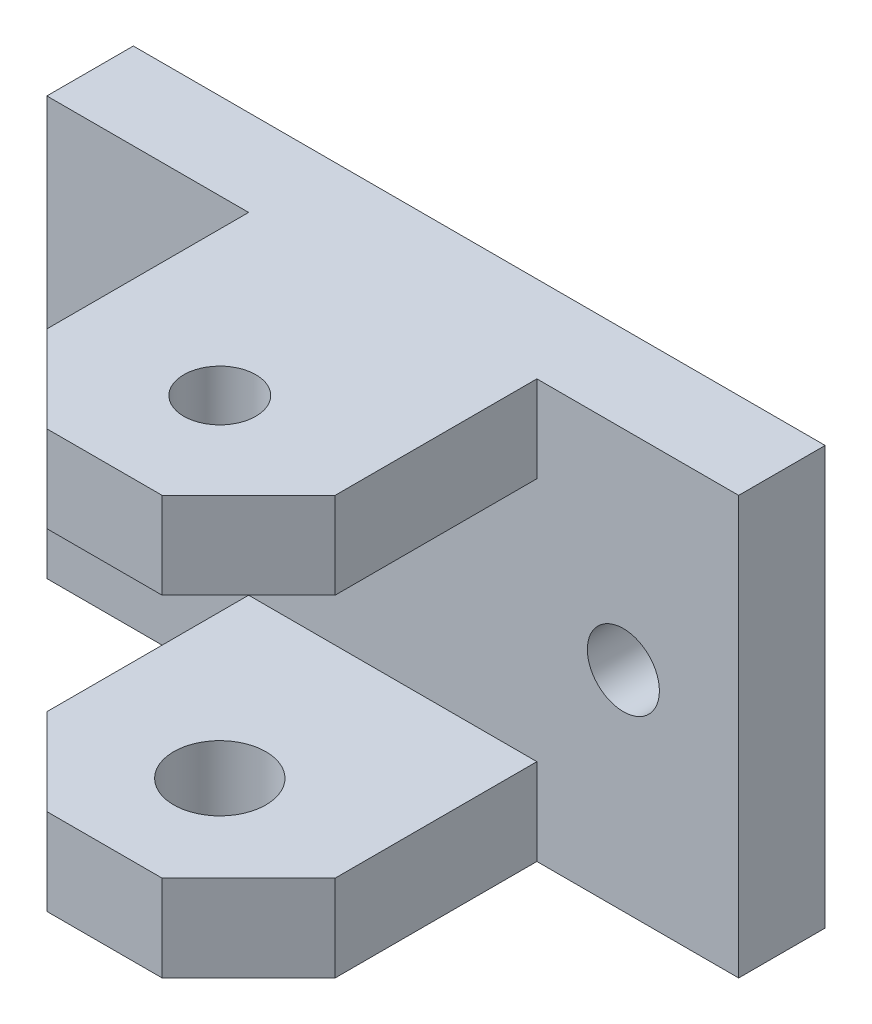
ISO-10303-21;
HEADER;
FILE_DESCRIPTION(('STEP AP214'),'2;1');
FILE_NAME('part.step','',(''),(''),'','','');
FILE_SCHEMA(('AUTOMOTIVE_DESIGN { 1 0 10303 214 1 1 1 1 }'));
ENDSEC;
DATA;
#1=APPLICATION_CONTEXT('core data for automotive mechanical design processes');
#2=APPLICATION_PROTOCOL_DEFINITION('international standard','automotive_design',2000,#1);
#3=PRODUCT_CONTEXT('',#1,'mechanical');
#4=PRODUCT('Part','Part','',(#3));
#5=PRODUCT_RELATED_PRODUCT_CATEGORY('part','',(#4));
#6=PRODUCT_DEFINITION_FORMATION('','',#4);
#7=PRODUCT_DEFINITION_CONTEXT('part definition',#1,'design');
#8=PRODUCT_DEFINITION('design','',#6,#7);
#9=PRODUCT_DEFINITION_SHAPE('','',#8);
#10=(LENGTH_UNIT() NAMED_UNIT(*) SI_UNIT(.MILLI.,.METRE.));
#11=(NAMED_UNIT(*) PLANE_ANGLE_UNIT() SI_UNIT($,.RADIAN.));
#12=(NAMED_UNIT(*) SI_UNIT($,.STERADIAN.) SOLID_ANGLE_UNIT());
#13=UNCERTAINTY_MEASURE_WITH_UNIT(LENGTH_MEASURE(1.E-05),#10,'distance_accuracy_value','');
#14=(GEOMETRIC_REPRESENTATION_CONTEXT(3) GLOBAL_UNCERTAINTY_ASSIGNED_CONTEXT((#13)) GLOBAL_UNIT_ASSIGNED_CONTEXT((#10,
#11,#12)) REPRESENTATION_CONTEXT('',''));
#15=CARTESIAN_POINT('',(0.,0.,0.));
#16=DIRECTION('',(0.,0.,1.));
#17=DIRECTION('',(1.,0.,0.));
#18=AXIS2_PLACEMENT_3D('',#15,#16,#17);
#19=CARTESIAN_POINT('',(0.,0.,3.));
#20=DIRECTION('',(0.,0.,-1.));
#21=DIRECTION('',(-1.,0.,0.));
#22=AXIS2_PLACEMENT_3D('',#19,#20,#21);
#23=PLANE('',#22);
#24=DIRECTION('',(-1.,0.,0.));
#25=VECTOR('',#24,1.);
#26=CARTESIAN_POINT('',(-12.,7.25,3.));
#27=LINE('',#26,#25);
#28=CARTESIAN_POINT('',(-5.,7.25,3.));
#29=VERTEX_POINT('',#28);
#30=CARTESIAN_POINT('',(-12.,7.25,3.));
#31=VERTEX_POINT('',#30);
#32=EDGE_CURVE('E264',#29,#31,#27,.T.);
#33=ORIENTED_EDGE('',*,*,#32,.T.);
#34=DIRECTION('',(0.,1.,0.));
#35=VECTOR('',#34,1.);
#36=CARTESIAN_POINT('',(-12.,7.25,3.));
#37=LINE('',#36,#35);
#38=CARTESIAN_POINT('',(-12.,-7.25,3.));
#39=VERTEX_POINT('',#38);
#40=EDGE_CURVE('E175',#39,#31,#37,.T.);
#41=ORIENTED_EDGE('',*,*,#40,.F.);
#42=DIRECTION('',(1.,0.,0.));
#43=VECTOR('',#42,1.);
#44=CARTESIAN_POINT('',(-12.,-7.25,3.));
#45=LINE('',#44,#43);
#46=CARTESIAN_POINT('',(-5.,-7.25,3.));
#47=VERTEX_POINT('',#46);
#48=EDGE_CURVE('E265',#39,#47,#45,.T.);
#49=ORIENTED_EDGE('',*,*,#48,.T.);
#50=DIRECTION('',(0.,-1.,0.));
#51=VECTOR('',#50,1.);
#52=CARTESIAN_POINT('',(-5.,0.,3.));
#53=LINE('',#52,#51);
#54=CARTESIAN_POINT('',(-5.,-4.25,3.));
#55=VERTEX_POINT('',#54);
#56=EDGE_CURVE('E256',#55,#47,#53,.T.);
#57=ORIENTED_EDGE('',*,*,#56,.F.);
#58=DIRECTION('',(1.,0.,0.));
#59=VECTOR('',#58,1.);
#60=CARTESIAN_POINT('',(0.,-4.25,3.));
#61=LINE('',#60,#59);
#62=CARTESIAN_POINT('',(5.,-4.25,3.));
#63=VERTEX_POINT('',#62);
#64=EDGE_CURVE('E251',#55,#63,#61,.T.);
#65=ORIENTED_EDGE('',*,*,#64,.T.);
#66=DIRECTION('',(0.,-1.,0.));
#67=VECTOR('',#66,1.);
#68=CARTESIAN_POINT('',(5.,0.,3.));
#69=LINE('',#68,#67);
#70=CARTESIAN_POINT('',(5.,-7.25,3.));
#71=VERTEX_POINT('',#70);
#72=EDGE_CURVE('E166',#63,#71,#69,.T.);
#73=ORIENTED_EDGE('',*,*,#72,.T.);
#74=CARTESIAN_POINT('',(12.,-7.25,3.));
#75=VERTEX_POINT('',#74);
#76=EDGE_CURVE('E263',#71,#75,#45,.T.);
#77=ORIENTED_EDGE('',*,*,#76,.T.);
#78=DIRECTION('',(0.,1.,0.));
#79=VECTOR('',#78,1.);
#80=CARTESIAN_POINT('',(12.,7.25,3.));
#81=LINE('',#80,#79);
#82=CARTESIAN_POINT('',(12.,7.25,3.));
#83=VERTEX_POINT('',#82);
#84=EDGE_CURVE('E179',#75,#83,#81,.T.);
#85=ORIENTED_EDGE('',*,*,#84,.T.);
#86=CARTESIAN_POINT('',(5.,7.25,3.));
#87=VERTEX_POINT('',#86);
#88=EDGE_CURVE('E261',#83,#87,#27,.T.);
#89=ORIENTED_EDGE('',*,*,#88,.T.);
#90=DIRECTION('',(0.,1.,0.));
#91=VECTOR('',#90,1.);
#92=CARTESIAN_POINT('',(5.,0.,3.));
#93=LINE('',#92,#91);
#94=CARTESIAN_POINT('',(5.,4.25,3.));
#95=VERTEX_POINT('',#94);
#96=EDGE_CURVE('E241',#95,#87,#93,.T.);
#97=ORIENTED_EDGE('',*,*,#96,.F.);
#98=DIRECTION('',(-1.,0.,0.));
#99=VECTOR('',#98,1.);
#100=CARTESIAN_POINT('',(0.,4.25,3.));
#101=LINE('',#100,#99);
#102=CARTESIAN_POINT('',(-5.,4.25,3.));
#103=VERTEX_POINT('',#102);
#104=EDGE_CURVE('E232',#95,#103,#101,.T.);
#105=ORIENTED_EDGE('',*,*,#104,.T.);
#106=DIRECTION('',(0.,1.,0.));
#107=VECTOR('',#106,1.);
#108=CARTESIAN_POINT('',(-5.,0.,3.));
#109=LINE('',#108,#107);
#110=EDGE_CURVE('E238',#103,#29,#109,.T.);
#111=ORIENTED_EDGE('',*,*,#110,.T.);
#112=EDGE_LOOP('',(#33,#41,#49,#57,#65,#73,#77,#85,#89,#97,#105,#111));
#113=FACE_BOUND('',#112,.T.);
#114=CARTESIAN_POINT('',(8.,0.,3.));
#115=DIRECTION('',(0.,0.,1.));
#116=DIRECTION('',(1.,0.,0.));
#117=AXIS2_PLACEMENT_3D('',#114,#115,#116);
#118=CIRCLE('',#117,1.24999999999999);
#119=CARTESIAN_POINT('',(9.24999999999999,0.,3.));
#120=VERTEX_POINT('',#119);
#121=EDGE_CURVE('E206',#120,#120,#118,.T.);
#122=ORIENTED_EDGE('',*,*,#121,.F.);
#123=EDGE_LOOP('',(#122));
#124=FACE_BOUND('',#123,.T.);
#125=CARTESIAN_POINT('',(-8.,0.,3.));
#126=DIRECTION('',(0.,0.,1.));
#127=DIRECTION('',(1.,0.,0.));
#128=AXIS2_PLACEMENT_3D('',#125,#126,#127);
#129=CIRCLE('',#128,1.24999999999999);
#130=CARTESIAN_POINT('',(-6.75000000000001,0.,3.));
#131=VERTEX_POINT('',#130);
#132=EDGE_CURVE('E200',#131,#131,#129,.T.);
#133=ORIENTED_EDGE('',*,*,#132,.F.);
#134=EDGE_LOOP('',(#133));
#135=FACE_BOUND('',#134,.T.);
#136=ADVANCED_FACE('F38',(#113,#124,#135),#23,.F.);
#137=CARTESIAN_POINT('',(-12.,7.25,3.));
#138=DIRECTION('',(0.,-1.,0.));
#139=DIRECTION('',(0.,0.,-1.));
#140=AXIS2_PLACEMENT_3D('',#137,#138,#139);
#141=PLANE('',#140);
#142=DIRECTION('',(1.,0.,0.));
#143=VECTOR('',#142,1.);
#144=CARTESIAN_POINT('',(-5.,7.25,13.));
#145=LINE('',#144,#143);
#146=CARTESIAN_POINT('',(-2.,7.25,13.));
#147=VERTEX_POINT('',#146);
#148=CARTESIAN_POINT('',(1.99999999999999,7.25,13.));
#149=VERTEX_POINT('',#148);
#150=EDGE_CURVE('E194',#147,#149,#145,.T.);
#151=ORIENTED_EDGE('',*,*,#150,.T.);
#152=DIRECTION('',(-0.707106781186549,0.,0.707106781186546));
#153=VECTOR('',#152,1.);
#154=CARTESIAN_POINT('',(5.,7.25,10.));
#155=LINE('',#154,#153);
#156=CARTESIAN_POINT('',(5.,7.25,10.));
#157=VERTEX_POINT('',#156);
#158=EDGE_CURVE('E285',#149,#157,#155,.F.);
#159=ORIENTED_EDGE('',*,*,#158,.T.);
#160=DIRECTION('',(0.,0.,1.));
#161=VECTOR('',#160,1.);
#162=CARTESIAN_POINT('',(5.,7.25,0.));
#163=LINE('',#162,#161);
#164=EDGE_CURVE('E224',#87,#157,#163,.T.);
#165=ORIENTED_EDGE('',*,*,#164,.F.);
#166=ORIENTED_EDGE('',*,*,#88,.F.);
#167=DIRECTION('',(0.,0.,1.));
#168=VECTOR('',#167,1.);
#169=CARTESIAN_POINT('',(12.,7.25,-14.5086181285469));
#170=LINE('',#169,#168);
#171=CARTESIAN_POINT('',(12.,7.25,0.));
#172=VERTEX_POINT('',#171);
#173=EDGE_CURVE('E160',#172,#83,#170,.T.);
#174=ORIENTED_EDGE('',*,*,#173,.F.);
#175=DIRECTION('',(-1.,0.,0.));
#176=VECTOR('',#175,1.);
#177=CARTESIAN_POINT('',(-12.,7.25,0.));
#178=LINE('',#177,#176);
#179=CARTESIAN_POINT('',(-12.,7.25,0.));
#180=VERTEX_POINT('',#179);
#181=EDGE_CURVE('E152',#172,#180,#178,.T.);
#182=ORIENTED_EDGE('',*,*,#181,.T.);
#183=DIRECTION('',(0.,0.,1.));
#184=VECTOR('',#183,1.);
#185=CARTESIAN_POINT('',(-12.,7.25,-14.5086181285469));
#186=LINE('',#185,#184);
#187=EDGE_CURVE('E157',#180,#31,#186,.T.);
#188=ORIENTED_EDGE('',*,*,#187,.T.);
#189=ORIENTED_EDGE('',*,*,#32,.F.);
#190=DIRECTION('',(0.,0.,1.));
#191=VECTOR('',#190,1.);
#192=CARTESIAN_POINT('',(-5.,7.25,0.));
#193=LINE('',#192,#191);
#194=CARTESIAN_POINT('',(-5.,7.25,9.99999999999999));
#195=VERTEX_POINT('',#194);
#196=EDGE_CURVE('E229',#29,#195,#193,.T.);
#197=ORIENTED_EDGE('',*,*,#196,.T.);
#198=DIRECTION('',(0.707106781186546,0.,0.707106781186549));
#199=VECTOR('',#198,1.);
#200=CARTESIAN_POINT('',(-2.,7.25,13.));
#201=LINE('',#200,#199);
#202=EDGE_CURVE('E283',#195,#147,#201,.T.);
#203=ORIENTED_EDGE('',*,*,#202,.T.);
#204=EDGE_LOOP('',(#151,#159,#165,#166,#174,#182,#188,#189,#197,#203));
#205=FACE_BOUND('',#204,.T.);
#206=CARTESIAN_POINT('',(0.,7.25,9.));
#207=DIRECTION('',(0.,1.,0.));
#208=DIRECTION('',(0.,0.,1.));
#209=AXIS2_PLACEMENT_3D('',#206,#207,#208);
#210=CIRCLE('',#209,1.24999999999999);
#211=CARTESIAN_POINT('',(0.,7.25,10.25));
#212=VERTEX_POINT('',#211);
#213=EDGE_CURVE('E212',#212,#212,#210,.T.);
#214=ORIENTED_EDGE('',*,*,#213,.F.);
#215=EDGE_LOOP('',(#214));
#216=FACE_BOUND('',#215,.T.);
#217=ADVANCED_FACE('F155',(#205,#216),#141,.F.);
#218=CARTESIAN_POINT('',(-12.,-7.25,3.));
#219=DIRECTION('',(0.,1.,0.));
#220=DIRECTION('',(0.,0.,1.));
#221=AXIS2_PLACEMENT_3D('',#218,#219,#220);
#222=PLANE('',#221);
#223=CARTESIAN_POINT('',(0.,-7.25,9.));
#224=DIRECTION('',(0.,-1.,0.));
#225=DIRECTION('',(0.,0.,-1.));
#226=AXIS2_PLACEMENT_3D('',#223,#224,#225);
#227=CIRCLE('',#226,1.6);
#228=CARTESIAN_POINT('',(0.,-7.25,7.4));
#229=VERTEX_POINT('',#228);
#230=EDGE_CURVE('E221',#229,#229,#227,.T.);
#231=ORIENTED_EDGE('',*,*,#230,.F.);
#232=EDGE_LOOP('',(#231));
#233=FACE_BOUND('',#232,.T.);
#234=DIRECTION('',(0.,0.,1.));
#235=VECTOR('',#234,1.);
#236=CARTESIAN_POINT('',(5.,-7.25,0.));
#237=LINE('',#236,#235);
#238=CARTESIAN_POINT('',(5.,-7.25,10.));
#239=VERTEX_POINT('',#238);
#240=EDGE_CURVE('E244',#71,#239,#237,.T.);
#241=ORIENTED_EDGE('',*,*,#240,.T.);
#242=DIRECTION('',(-0.707106781186549,0.,0.707106781186546));
#243=VECTOR('',#242,1.);
#244=CARTESIAN_POINT('',(5.,-7.25,10.));
#245=LINE('',#244,#243);
#246=CARTESIAN_POINT('',(1.99999999999999,-7.25,13.));
#247=VERTEX_POINT('',#246);
#248=EDGE_CURVE('E292',#239,#247,#245,.T.);
#249=ORIENTED_EDGE('',*,*,#248,.T.);
#250=DIRECTION('',(1.,0.,0.));
#251=VECTOR('',#250,1.);
#252=CARTESIAN_POINT('',(-5.,-7.25,13.));
#253=LINE('',#252,#251);
#254=CARTESIAN_POINT('',(-2.,-7.25,13.));
#255=VERTEX_POINT('',#254);
#256=EDGE_CURVE('E191',#255,#247,#253,.T.);
#257=ORIENTED_EDGE('',*,*,#256,.F.);
#258=DIRECTION('',(0.707106781186546,0.,0.707106781186549));
#259=VECTOR('',#258,1.);
#260=CARTESIAN_POINT('',(-2.,-7.25,13.));
#261=LINE('',#260,#259);
#262=CARTESIAN_POINT('',(-5.,-7.25,9.99999999999999));
#263=VERTEX_POINT('',#262);
#264=EDGE_CURVE('E290',#255,#263,#261,.F.);
#265=ORIENTED_EDGE('',*,*,#264,.T.);
#266=DIRECTION('',(0.,0.,1.));
#267=VECTOR('',#266,1.);
#268=CARTESIAN_POINT('',(-5.,-7.25,0.));
#269=LINE('',#268,#267);
#270=EDGE_CURVE('E249',#47,#263,#269,.T.);
#271=ORIENTED_EDGE('',*,*,#270,.F.);
#272=ORIENTED_EDGE('',*,*,#48,.F.);
#273=DIRECTION('',(0.,0.,1.));
#274=VECTOR('',#273,1.);
#275=CARTESIAN_POINT('',(-12.,-7.25,-14.5086181285469));
#276=LINE('',#275,#274);
#277=CARTESIAN_POINT('',(-12.,-7.25,0.));
#278=VERTEX_POINT('',#277);
#279=EDGE_CURVE('E186',#278,#39,#276,.T.);
#280=ORIENTED_EDGE('',*,*,#279,.F.);
#281=DIRECTION('',(1.,0.,0.));
#282=VECTOR('',#281,1.);
#283=CARTESIAN_POINT('',(-12.,-7.25,0.));
#284=LINE('',#283,#282);
#285=CARTESIAN_POINT('',(12.,-7.25,0.));
#286=VERTEX_POINT('',#285);
#287=EDGE_CURVE('E165',#278,#286,#284,.T.);
#288=ORIENTED_EDGE('',*,*,#287,.T.);
#289=DIRECTION('',(0.,0.,1.));
#290=VECTOR('',#289,1.);
#291=CARTESIAN_POINT('',(12.,-7.25,-14.5086181285469));
#292=LINE('',#291,#290);
#293=EDGE_CURVE('E182',#286,#75,#292,.T.);
#294=ORIENTED_EDGE('',*,*,#293,.T.);
#295=ORIENTED_EDGE('',*,*,#76,.F.);
#296=EDGE_LOOP('',(#241,#249,#257,#265,#271,#272,#280,#288,#294,#295));
#297=FACE_BOUND('',#296,.T.);
#298=ADVANCED_FACE('F316',(#233,#297),#222,.F.);
#299=CARTESIAN_POINT('',(0.,0.,0.));
#300=DIRECTION('',(0.,0.,-1.));
#301=DIRECTION('',(-1.,0.,0.));
#302=AXIS2_PLACEMENT_3D('',#299,#300,#301);
#303=PLANE('',#302);
#304=ORIENTED_EDGE('',*,*,#287,.F.);
#305=DIRECTION('',(0.,1.,0.));
#306=VECTOR('',#305,1.);
#307=CARTESIAN_POINT('',(-12.,7.25,0.));
#308=LINE('',#307,#306);
#309=EDGE_CURVE('E172',#278,#180,#308,.T.);
#310=ORIENTED_EDGE('',*,*,#309,.T.);
#311=ORIENTED_EDGE('',*,*,#181,.F.);
#312=DIRECTION('',(0.,1.,0.));
#313=VECTOR('',#312,1.);
#314=CARTESIAN_POINT('',(12.,7.25,0.));
#315=LINE('',#314,#313);
#316=EDGE_CURVE('E188',#286,#172,#315,.T.);
#317=ORIENTED_EDGE('',*,*,#316,.F.);
#318=EDGE_LOOP('',(#304,#310,#311,#317));
#319=FACE_BOUND('',#318,.T.);
#320=CARTESIAN_POINT('',(-8.,0.,0.));
#321=DIRECTION('',(0.,0.,-1.));
#322=DIRECTION('',(-1.,0.,0.));
#323=AXIS2_PLACEMENT_3D('',#320,#321,#322);
#324=CIRCLE('',#323,1.24999999999999);
#325=CARTESIAN_POINT('',(-9.24999999999999,0.,0.));
#326=VERTEX_POINT('',#325);
#327=EDGE_CURVE('E203',#326,#326,#324,.T.);
#328=ORIENTED_EDGE('',*,*,#327,.F.);
#329=EDGE_LOOP('',(#328));
#330=FACE_BOUND('',#329,.T.);
#331=CARTESIAN_POINT('',(8.,0.,0.));
#332=DIRECTION('',(0.,0.,-1.));
#333=DIRECTION('',(-1.,0.,0.));
#334=AXIS2_PLACEMENT_3D('',#331,#332,#333);
#335=CIRCLE('',#334,1.24999999999999);
#336=CARTESIAN_POINT('',(6.75000000000001,0.,0.));
#337=VERTEX_POINT('',#336);
#338=EDGE_CURVE('E209',#337,#337,#335,.T.);
#339=ORIENTED_EDGE('',*,*,#338,.F.);
#340=EDGE_LOOP('',(#339));
#341=FACE_BOUND('',#340,.T.);
#342=ADVANCED_FACE('F177',(#319,#330,#341),#303,.T.);
#343=CARTESIAN_POINT('',(5.,-4.25,0.));
#344=DIRECTION('',(1.,0.,0.));
#345=DIRECTION('',(0.,0.,-1.));
#346=AXIS2_PLACEMENT_3D('',#343,#344,#345);
#347=PLANE('',#346);
#348=DIRECTION('',(0.,0.,1.));
#349=VECTOR('',#348,1.);
#350=CARTESIAN_POINT('',(5.,-4.25,0.));
#351=LINE('',#350,#349);
#352=CARTESIAN_POINT('',(5.,-4.25,10.));
#353=VERTEX_POINT('',#352);
#354=EDGE_CURVE('E245',#63,#353,#351,.T.);
#355=ORIENTED_EDGE('',*,*,#354,.T.);
#356=DIRECTION('',(0.,-1.,0.));
#357=VECTOR('',#356,1.);
#358=CARTESIAN_POINT('',(5.,-7.25,10.));
#359=LINE('',#358,#357);
#360=EDGE_CURVE('E287',#353,#239,#359,.T.);
#361=ORIENTED_EDGE('',*,*,#360,.T.);
#362=ORIENTED_EDGE('',*,*,#240,.F.);
#363=ORIENTED_EDGE('',*,*,#72,.F.);
#364=EDGE_LOOP('',(#355,#361,#362,#363));
#365=FACE_BOUND('',#364,.T.);
#366=ADVANCED_FACE('F311',(#365),#347,.T.);
#367=CARTESIAN_POINT('',(-5.,-4.25,0.));
#368=DIRECTION('',(1.,0.,0.));
#369=DIRECTION('',(0.,0.,-1.));
#370=AXIS2_PLACEMENT_3D('',#367,#368,#369);
#371=PLANE('',#370);
#372=ORIENTED_EDGE('',*,*,#270,.T.);
#373=DIRECTION('',(0.,1.,0.));
#374=VECTOR('',#373,1.);
#375=CARTESIAN_POINT('',(-5.,-4.25,9.99999999999999));
#376=LINE('',#375,#374);
#377=CARTESIAN_POINT('',(-5.,-4.25,9.99999999999999));
#378=VERTEX_POINT('',#377);
#379=EDGE_CURVE('E46',#263,#378,#376,.T.);
#380=ORIENTED_EDGE('',*,*,#379,.T.);
#381=DIRECTION('',(0.,0.,1.));
#382=VECTOR('',#381,1.);
#383=CARTESIAN_POINT('',(-5.,-4.25,0.));
#384=LINE('',#383,#382);
#385=EDGE_CURVE('E248',#55,#378,#384,.T.);
#386=ORIENTED_EDGE('',*,*,#385,.F.);
#387=ORIENTED_EDGE('',*,*,#56,.T.);
#388=EDGE_LOOP('',(#372,#380,#386,#387));
#389=FACE_BOUND('',#388,.T.);
#390=ADVANCED_FACE('F323',(#389),#371,.F.);
#391=CARTESIAN_POINT('',(0.,-4.25,0.));
#392=DIRECTION('',(0.,1.,0.));
#393=DIRECTION('',(-1.,0.,0.));
#394=AXIS2_PLACEMENT_3D('',#391,#392,#393);
#395=PLANE('',#394);
#396=DIRECTION('',(-1.,0.,0.));
#397=VECTOR('',#396,1.);
#398=CARTESIAN_POINT('',(0.,-4.25,13.));
#399=LINE('',#398,#397);
#400=CARTESIAN_POINT('',(1.99999999999999,-4.25,13.));
#401=VERTEX_POINT('',#400);
#402=CARTESIAN_POINT('',(-2.,-4.25,13.));
#403=VERTEX_POINT('',#402);
#404=EDGE_CURVE('E196',#401,#403,#399,.T.);
#405=ORIENTED_EDGE('',*,*,#404,.F.);
#406=DIRECTION('',(0.707106781186549,0.,-0.707106781186546));
#407=VECTOR('',#406,1.);
#408=CARTESIAN_POINT('',(7.49999999999999,-4.25,7.50000000000002));
#409=LINE('',#408,#407);
#410=EDGE_CURVE('E300',#401,#353,#409,.T.);
#411=ORIENTED_EDGE('',*,*,#410,.T.);
#412=ORIENTED_EDGE('',*,*,#354,.F.);
#413=ORIENTED_EDGE('',*,*,#64,.F.);
#414=ORIENTED_EDGE('',*,*,#385,.T.);
#415=DIRECTION('',(-0.707106781186546,0.,-0.707106781186549));
#416=VECTOR('',#415,1.);
#417=CARTESIAN_POINT('',(-7.5,-4.25,7.49999999999997));
#418=LINE('',#417,#416);
#419=EDGE_CURVE('E59',#378,#403,#418,.F.);
#420=ORIENTED_EDGE('',*,*,#419,.T.);
#421=EDGE_LOOP('',(#405,#411,#412,#413,#414,#420));
#422=FACE_BOUND('',#421,.T.);
#423=CARTESIAN_POINT('',(0.,-4.25,9.));
#424=DIRECTION('',(0.,1.,0.));
#425=DIRECTION('',(0.,0.,1.));
#426=AXIS2_PLACEMENT_3D('',#423,#424,#425);
#427=CIRCLE('',#426,1.6);
#428=CARTESIAN_POINT('',(0.,-4.25,7.4));
#429=VERTEX_POINT('',#428);
#430=EDGE_CURVE('E218',#429,#429,#427,.F.);
#431=ORIENTED_EDGE('',*,*,#430,.T.);
#432=EDGE_LOOP('',(#431));
#433=FACE_BOUND('',#432,.T.);
#434=ADVANCED_FACE('F303',(#422,#433),#395,.T.);
#435=CARTESIAN_POINT('',(5.,4.25,0.));
#436=DIRECTION('',(-1.,0.,0.));
#437=DIRECTION('',(0.,0.,1.));
#438=AXIS2_PLACEMENT_3D('',#435,#436,#437);
#439=PLANE('',#438);
#440=ORIENTED_EDGE('',*,*,#164,.T.);
#441=DIRECTION('',(0.,-1.,0.));
#442=VECTOR('',#441,1.);
#443=CARTESIAN_POINT('',(5.,4.25,10.));
#444=LINE('',#443,#442);
#445=CARTESIAN_POINT('',(5.,4.25,10.));
#446=VERTEX_POINT('',#445);
#447=EDGE_CURVE('E271',#157,#446,#444,.T.);
#448=ORIENTED_EDGE('',*,*,#447,.T.);
#449=DIRECTION('',(0.,0.,1.));
#450=VECTOR('',#449,1.);
#451=CARTESIAN_POINT('',(5.,4.25,0.));
#452=LINE('',#451,#450);
#453=EDGE_CURVE('E225',#95,#446,#452,.T.);
#454=ORIENTED_EDGE('',*,*,#453,.F.);
#455=ORIENTED_EDGE('',*,*,#96,.T.);
#456=EDGE_LOOP('',(#440,#448,#454,#455));
#457=FACE_BOUND('',#456,.T.);
#458=ADVANCED_FACE('F334',(#457),#439,.F.);
#459=CARTESIAN_POINT('',(-5.,4.25,0.));
#460=DIRECTION('',(-1.,0.,0.));
#461=DIRECTION('',(0.,0.,1.));
#462=AXIS2_PLACEMENT_3D('',#459,#460,#461);
#463=PLANE('',#462);
#464=DIRECTION('',(0.,0.,1.));
#465=VECTOR('',#464,1.);
#466=CARTESIAN_POINT('',(-5.,4.25,0.));
#467=LINE('',#466,#465);
#468=CARTESIAN_POINT('',(-5.,4.25,9.99999999999999));
#469=VERTEX_POINT('',#468);
#470=EDGE_CURVE('E228',#103,#469,#467,.T.);
#471=ORIENTED_EDGE('',*,*,#470,.T.);
#472=DIRECTION('',(0.,1.,0.));
#473=VECTOR('',#472,1.);
#474=CARTESIAN_POINT('',(-5.,7.25,9.99999999999999));
#475=LINE('',#474,#473);
#476=EDGE_CURVE('E11',#469,#195,#475,.T.);
#477=ORIENTED_EDGE('',*,*,#476,.T.);
#478=ORIENTED_EDGE('',*,*,#196,.F.);
#479=ORIENTED_EDGE('',*,*,#110,.F.);
#480=EDGE_LOOP('',(#471,#477,#478,#479));
#481=FACE_BOUND('',#480,.T.);
#482=ADVANCED_FACE('F349',(#481),#463,.T.);
#483=CARTESIAN_POINT('',(0.,4.25,0.));
#484=DIRECTION('',(0.,-1.,0.));
#485=DIRECTION('',(-1.,0.,0.));
#486=AXIS2_PLACEMENT_3D('',#483,#484,#485);
#487=PLANE('',#486);
#488=ORIENTED_EDGE('',*,*,#453,.T.);
#489=DIRECTION('',(0.707106781186549,0.,-0.707106781186546));
#490=VECTOR('',#489,1.);
#491=CARTESIAN_POINT('',(7.49999999999999,4.25,7.50000000000002));
#492=LINE('',#491,#490);
#493=CARTESIAN_POINT('',(1.99999999999999,4.25,13.));
#494=VERTEX_POINT('',#493);
#495=EDGE_CURVE('E276',#446,#494,#492,.F.);
#496=ORIENTED_EDGE('',*,*,#495,.T.);
#497=DIRECTION('',(1.,0.,0.));
#498=VECTOR('',#497,1.);
#499=CARTESIAN_POINT('',(0.,4.25,13.));
#500=LINE('',#499,#498);
#501=CARTESIAN_POINT('',(-2.,4.25,13.));
#502=VERTEX_POINT('',#501);
#503=EDGE_CURVE('E266',#502,#494,#500,.T.);
#504=ORIENTED_EDGE('',*,*,#503,.F.);
#505=DIRECTION('',(-0.707106781186546,0.,-0.707106781186549));
#506=VECTOR('',#505,1.);
#507=CARTESIAN_POINT('',(-7.5,4.25,7.49999999999997));
#508=LINE('',#507,#506);
#509=EDGE_CURVE('E274',#502,#469,#508,.T.);
#510=ORIENTED_EDGE('',*,*,#509,.T.);
#511=ORIENTED_EDGE('',*,*,#470,.F.);
#512=ORIENTED_EDGE('',*,*,#104,.F.);
#513=EDGE_LOOP('',(#488,#496,#504,#510,#511,#512));
#514=FACE_BOUND('',#513,.T.);
#515=CARTESIAN_POINT('',(0.,4.25,9.));
#516=DIRECTION('',(0.,-1.,0.));
#517=DIRECTION('',(0.,0.,-1.));
#518=AXIS2_PLACEMENT_3D('',#515,#516,#517);
#519=CIRCLE('',#518,1.24999999999999);
#520=CARTESIAN_POINT('',(0.,4.25,7.75000000000001));
#521=VERTEX_POINT('',#520);
#522=EDGE_CURVE('E215',#521,#521,#519,.T.);
#523=ORIENTED_EDGE('',*,*,#522,.F.);
#524=EDGE_LOOP('',(#523));
#525=FACE_BOUND('',#524,.T.);
#526=ADVANCED_FACE('F342',(#514,#525),#487,.T.);
#527=CARTESIAN_POINT('',(0.,7.251,9.));
#528=DIRECTION('',(0.,-1.,0.));
#529=DIRECTION('',(0.,0.,-1.));
#530=AXIS2_PLACEMENT_3D('',#527,#528,#529);
#531=CYLINDRICAL_SURFACE('',#530,1.6);
#532=CARTESIAN_POINT('',(0.,-4.25,7.4));
#533=CARTESIAN_POINT('',(0.,-4.28125,7.4));
#534=CARTESIAN_POINT('',(0.,-4.3125,7.4));
#535=CARTESIAN_POINT('',(0.,-4.375,7.4));
#536=CARTESIAN_POINT('',(0.,-4.40625,7.4));
#537=CARTESIAN_POINT('',(0.,-4.46875,7.4));
#538=CARTESIAN_POINT('',(0.,-4.5,7.4));
#539=CARTESIAN_POINT('',(0.,-4.5625,7.4));
#540=CARTESIAN_POINT('',(0.,-4.59375,7.4));
#541=CARTESIAN_POINT('',(0.,-4.65625,7.4));
#542=CARTESIAN_POINT('',(0.,-4.6875,7.4));
#543=CARTESIAN_POINT('',(0.,-4.75,7.4));
#544=CARTESIAN_POINT('',(0.,-4.78125,7.4));
#545=CARTESIAN_POINT('',(0.,-4.84375,7.4));
#546=CARTESIAN_POINT('',(0.,-4.875,7.4));
#547=CARTESIAN_POINT('',(0.,-4.9375,7.4));
#548=CARTESIAN_POINT('',(0.,-4.96875,7.4));
#549=CARTESIAN_POINT('',(0.,-5.03125,7.4));
#550=CARTESIAN_POINT('',(0.,-5.0625,7.4));
#551=CARTESIAN_POINT('',(0.,-5.125,7.4));
#552=CARTESIAN_POINT('',(0.,-5.15625,7.4));
#553=CARTESIAN_POINT('',(0.,-5.21875,7.4));
#554=CARTESIAN_POINT('',(0.,-5.25,7.4));
#555=CARTESIAN_POINT('',(0.,-5.3125,7.4));
#556=CARTESIAN_POINT('',(0.,-5.34375,7.4));
#557=CARTESIAN_POINT('',(0.,-5.40625,7.4));
#558=CARTESIAN_POINT('',(0.,-5.4375,7.4));
#559=CARTESIAN_POINT('',(0.,-5.5,7.4));
#560=CARTESIAN_POINT('',(0.,-5.53125,7.4));
#561=CARTESIAN_POINT('',(0.,-5.59375,7.4));
#562=CARTESIAN_POINT('',(0.,-5.625,7.4));
#563=CARTESIAN_POINT('',(0.,-5.6875,7.4));
#564=CARTESIAN_POINT('',(0.,-5.71875,7.4));
#565=CARTESIAN_POINT('',(0.,-5.78125,7.4));
#566=CARTESIAN_POINT('',(0.,-5.8125,7.4));
#567=CARTESIAN_POINT('',(0.,-5.875,7.4));
#568=CARTESIAN_POINT('',(0.,-5.90625,7.4));
#569=CARTESIAN_POINT('',(0.,-5.96875,7.4));
#570=CARTESIAN_POINT('',(0.,-6.,7.4));
#571=CARTESIAN_POINT('',(0.,-6.0625,7.4));
#572=CARTESIAN_POINT('',(0.,-6.09375,7.4));
#573=CARTESIAN_POINT('',(0.,-6.15625,7.4));
#574=CARTESIAN_POINT('',(0.,-6.1875,7.4));
#575=CARTESIAN_POINT('',(0.,-6.25,7.4));
#576=CARTESIAN_POINT('',(0.,-6.28125,7.4));
#577=CARTESIAN_POINT('',(0.,-6.34375,7.4));
#578=CARTESIAN_POINT('',(0.,-6.375,7.4));
#579=CARTESIAN_POINT('',(0.,-6.4375,7.4));
#580=CARTESIAN_POINT('',(0.,-6.46875,7.4));
#581=CARTESIAN_POINT('',(0.,-6.53125,7.4));
#582=CARTESIAN_POINT('',(0.,-6.5625,7.4));
#583=CARTESIAN_POINT('',(0.,-6.625,7.4));
#584=CARTESIAN_POINT('',(0.,-6.65625,7.4));
#585=CARTESIAN_POINT('',(0.,-6.71875,7.4));
#586=CARTESIAN_POINT('',(0.,-6.75,7.4));
#587=CARTESIAN_POINT('',(0.,-6.8125,7.4));
#588=CARTESIAN_POINT('',(0.,-6.84375,7.4));
#589=CARTESIAN_POINT('',(0.,-6.90625,7.4));
#590=CARTESIAN_POINT('',(0.,-6.9375,7.4));
#591=CARTESIAN_POINT('',(0.,-7.,7.4));
#592=CARTESIAN_POINT('',(0.,-7.03125,7.4));
#593=CARTESIAN_POINT('',(0.,-7.09375,7.4));
#594=CARTESIAN_POINT('',(0.,-7.125,7.4));
#595=CARTESIAN_POINT('',(0.,-7.1875,7.4));
#596=CARTESIAN_POINT('',(0.,-7.21875,7.4));
#597=CARTESIAN_POINT('',(0.,-7.25,7.4));
#598=B_SPLINE_CURVE_WITH_KNOTS('',3,(#532,#533,#534,#535,#536,#537,#538,#539,#540,#541,#542,
#543,#544,#545,#546,#547,#548,#549,#550,#551,#552,#553,#554,#555,#556,#557,#558,#559,#560,#561,
#562,#563,#564,#565,#566,#567,#568,#569,#570,#571,#572,#573,#574,#575,#576,#577,#578,#579,#580,
#581,#582,#583,#584,#585,#586,#587,#588,#589,#590,#591,#592,#593,#594,#595,#596,#597),
.UNSPECIFIED.,.F.,.F.,(4,2,2,2,2,2,2,2,2,2,2,2,2,2,2,2,2,2,2,2,2,2,2,2,2,2,2,2,2,2,2,2,4),(0.,
0.0937500000000001,0.1875,0.28125,0.375,0.468749999999999,0.562499999999999,0.656249999999999,
0.749999999999999,0.843749999999999,0.937499999999999,1.03125,1.125,1.21875,1.3125,1.40625,1.5,
1.59375,1.6875,1.78125,1.875,1.96875,2.0625,2.15625,2.25,2.34375,2.4375,2.53125,2.625,2.71875,
2.8125,2.90625,3.),.UNSPECIFIED.);
#599=EDGE_CURVE('BSEAM468',#429,#229,#598,.T.);
#600=ORIENTED_EDGE('',*,*,#430,.F.);
#601=ORIENTED_EDGE('',*,*,#230,.T.);
#602=ORIENTED_EDGE('',*,*,#599,.T.);
#603=ORIENTED_EDGE('',*,*,#599,.F.);
#604=EDGE_LOOP('',(#600,#602,#601,#603));
#605=FACE_BOUND('',#604,.T.);
#606=ADVANCED_FACE('F468',(#605),#531,.F.);
#607=CARTESIAN_POINT('',(0.,7.25,9.));
#608=DIRECTION('',(0.,1.,0.));
#609=DIRECTION('',(0.,0.,1.));
#610=AXIS2_PLACEMENT_3D('',#607,#608,#609);
#611=CYLINDRICAL_SURFACE('',#610,1.24999999999999);
#612=ORIENTED_EDGE('',*,*,#213,.T.);
#613=EDGE_LOOP('',(#612));
#614=FACE_BOUND('',#613,.T.);
#615=ORIENTED_EDGE('',*,*,#522,.T.);
#616=EDGE_LOOP('',(#615));
#617=FACE_BOUND('',#616,.T.);
#618=ADVANCED_FACE('F525',(#614,#617),#611,.F.);
#619=CARTESIAN_POINT('',(8.,0.,3.));
#620=DIRECTION('',(0.,0.,1.));
#621=DIRECTION('',(1.,0.,0.));
#622=AXIS2_PLACEMENT_3D('',#619,#620,#621);
#623=CYLINDRICAL_SURFACE('',#622,1.24999999999999);
#624=ORIENTED_EDGE('',*,*,#121,.T.);
#625=EDGE_LOOP('',(#624));
#626=FACE_BOUND('',#625,.T.);
#627=ORIENTED_EDGE('',*,*,#338,.T.);
#628=EDGE_LOOP('',(#627));
#629=FACE_BOUND('',#628,.T.);
#630=ADVANCED_FACE('F363',(#626,#629),#623,.F.);
#631=CARTESIAN_POINT('',(-8.,0.,3.));
#632=DIRECTION('',(0.,0.,1.));
#633=DIRECTION('',(1.,0.,0.));
#634=AXIS2_PLACEMENT_3D('',#631,#632,#633);
#635=CYLINDRICAL_SURFACE('',#634,1.24999999999999);
#636=ORIENTED_EDGE('',*,*,#132,.T.);
#637=EDGE_LOOP('',(#636));
#638=FACE_BOUND('',#637,.T.);
#639=ORIENTED_EDGE('',*,*,#327,.T.);
#640=EDGE_LOOP('',(#639));
#641=FACE_BOUND('',#640,.T.);
#642=ADVANCED_FACE('F357',(#638,#641),#635,.F.);
#643=CARTESIAN_POINT('',(-5.,7.25,13.));
#644=DIRECTION('',(0.,0.,-1.));
#645=DIRECTION('',(-1.,0.,0.));
#646=AXIS2_PLACEMENT_3D('',#643,#644,#645);
#647=PLANE('',#646);
#648=ORIENTED_EDGE('',*,*,#503,.T.);
#649=DIRECTION('',(0.,1.,0.));
#650=VECTOR('',#649,1.);
#651=CARTESIAN_POINT('',(1.99999999999999,7.25,13.));
#652=LINE('',#651,#650);
#653=EDGE_CURVE('E281',#494,#149,#652,.T.);
#654=ORIENTED_EDGE('',*,*,#653,.T.);
#655=ORIENTED_EDGE('',*,*,#150,.F.);
#656=DIRECTION('',(0.,-1.,0.));
#657=VECTOR('',#656,1.);
#658=CARTESIAN_POINT('',(-2.,4.25,13.));
#659=LINE('',#658,#657);
#660=EDGE_CURVE('E278',#147,#502,#659,.T.);
#661=ORIENTED_EDGE('',*,*,#660,.T.);
#662=EDGE_LOOP('',(#648,#654,#655,#661));
#663=FACE_BOUND('',#662,.T.);
#664=ADVANCED_FACE('F355',(#663),#647,.F.);
#665=ORIENTED_EDGE('',*,*,#256,.T.);
#666=DIRECTION('',(0.,1.,0.));
#667=VECTOR('',#666,1.);
#668=CARTESIAN_POINT('',(1.99999999999999,-4.25,13.));
#669=LINE('',#668,#667);
#670=EDGE_CURVE('E297',#247,#401,#669,.T.);
#671=ORIENTED_EDGE('',*,*,#670,.T.);
#672=ORIENTED_EDGE('',*,*,#404,.T.);
#673=DIRECTION('',(0.,-1.,0.));
#674=VECTOR('',#673,1.);
#675=CARTESIAN_POINT('',(-2.,7.25,13.));
#676=LINE('',#675,#674);
#677=EDGE_CURVE('E294',#403,#255,#676,.T.);
#678=ORIENTED_EDGE('',*,*,#677,.T.);
#679=EDGE_LOOP('',(#665,#671,#672,#678));
#680=FACE_BOUND('',#679,.T.);
#681=ADVANCED_FACE('F318',(#680),#647,.F.);
#682=CARTESIAN_POINT('',(5.,4.25,10.));
#683=DIRECTION('',(-0.707106781186546,0.,-0.707106781186549));
#684=DIRECTION('',(0.,-1.,0.));
#685=AXIS2_PLACEMENT_3D('',#682,#683,#684);
#686=PLANE('',#685);
#687=ORIENTED_EDGE('',*,*,#158,.F.);
#688=ORIENTED_EDGE('',*,*,#653,.F.);
#689=ORIENTED_EDGE('',*,*,#495,.F.);
#690=ORIENTED_EDGE('',*,*,#447,.F.);
#691=EDGE_LOOP('',(#687,#688,#689,#690));
#692=FACE_BOUND('',#691,.T.);
#693=ADVANCED_FACE('F340',(#692),#686,.F.);
#694=CARTESIAN_POINT('',(5.,-4.25,10.));
#695=DIRECTION('',(0.707106781186546,0.,0.707106781186549));
#696=DIRECTION('',(0.,1.,0.));
#697=AXIS2_PLACEMENT_3D('',#694,#695,#696);
#698=PLANE('',#697);
#699=ORIENTED_EDGE('',*,*,#410,.F.);
#700=ORIENTED_EDGE('',*,*,#670,.F.);
#701=ORIENTED_EDGE('',*,*,#248,.F.);
#702=ORIENTED_EDGE('',*,*,#360,.F.);
#703=EDGE_LOOP('',(#699,#700,#701,#702));
#704=FACE_BOUND('',#703,.T.);
#705=ADVANCED_FACE('F313',(#704),#698,.T.);
#706=CARTESIAN_POINT('',(-2.,7.25,13.));
#707=DIRECTION('',(0.707106781186549,0.,-0.707106781186546));
#708=DIRECTION('',(0.,-1.,0.));
#709=AXIS2_PLACEMENT_3D('',#706,#707,#708);
#710=PLANE('',#709);
#711=ORIENTED_EDGE('',*,*,#419,.F.);
#712=ORIENTED_EDGE('',*,*,#379,.F.);
#713=ORIENTED_EDGE('',*,*,#264,.F.);
#714=ORIENTED_EDGE('',*,*,#677,.F.);
#715=EDGE_LOOP('',(#711,#712,#713,#714));
#716=FACE_BOUND('',#715,.T.);
#717=ADVANCED_FACE('F321',(#716),#710,.F.);
#718=CARTESIAN_POINT('',(-2.,7.25,13.));
#719=DIRECTION('',(-0.707106781186549,0.,0.707106781186546));
#720=DIRECTION('',(0.,1.,0.));
#721=AXIS2_PLACEMENT_3D('',#718,#719,#720);
#722=PLANE('',#721);
#723=ORIENTED_EDGE('',*,*,#202,.F.);
#724=ORIENTED_EDGE('',*,*,#476,.F.);
#725=ORIENTED_EDGE('',*,*,#509,.F.);
#726=ORIENTED_EDGE('',*,*,#660,.F.);
#727=EDGE_LOOP('',(#723,#724,#725,#726));
#728=FACE_BOUND('',#727,.T.);
#729=ADVANCED_FACE('F40',(#728),#722,.T.);
#730=CARTESIAN_POINT('',(12.,7.25,-14.5086181285469));
#731=DIRECTION('',(1.,0.,0.));
#732=DIRECTION('',(0.,1.,0.));
#733=AXIS2_PLACEMENT_3D('',#730,#731,#732);
#734=PLANE('',#733);
#735=ORIENTED_EDGE('',*,*,#293,.F.);
#736=ORIENTED_EDGE('',*,*,#316,.T.);
#737=ORIENTED_EDGE('',*,*,#173,.T.);
#738=ORIENTED_EDGE('',*,*,#84,.F.);
#739=EDGE_LOOP('',(#735,#736,#737,#738));
#740=FACE_BOUND('',#739,.T.);
#741=ADVANCED_FACE('F329',(#740),#734,.T.);
#742=CARTESIAN_POINT('',(-12.,7.25,-14.5086181285469));
#743=DIRECTION('',(1.,0.,0.));
#744=DIRECTION('',(0.,1.,0.));
#745=AXIS2_PLACEMENT_3D('',#742,#743,#744);
#746=PLANE('',#745);
#747=ORIENTED_EDGE('',*,*,#309,.F.);
#748=ORIENTED_EDGE('',*,*,#279,.T.);
#749=ORIENTED_EDGE('',*,*,#40,.T.);
#750=ORIENTED_EDGE('',*,*,#187,.F.);
#751=EDGE_LOOP('',(#747,#748,#749,#750));
#752=FACE_BOUND('',#751,.T.);
#753=ADVANCED_FACE('F170',(#752),#746,.F.);
#754=CLOSED_SHELL('',(#136,#217,#298,#342,#366,#390,#434,#458,#482,#526,#606,#618,#630,#642,
#664,#681,#693,#705,#717,#729,#741,#753));
#755=MANIFOLD_SOLID_BREP('B2',#754);
#756=ADVANCED_BREP_SHAPE_REPRESENTATION('',(#18,#755),#14);
#757=SHAPE_DEFINITION_REPRESENTATION(#9,#756);
ENDSEC;
END-ISO-10303-21;
